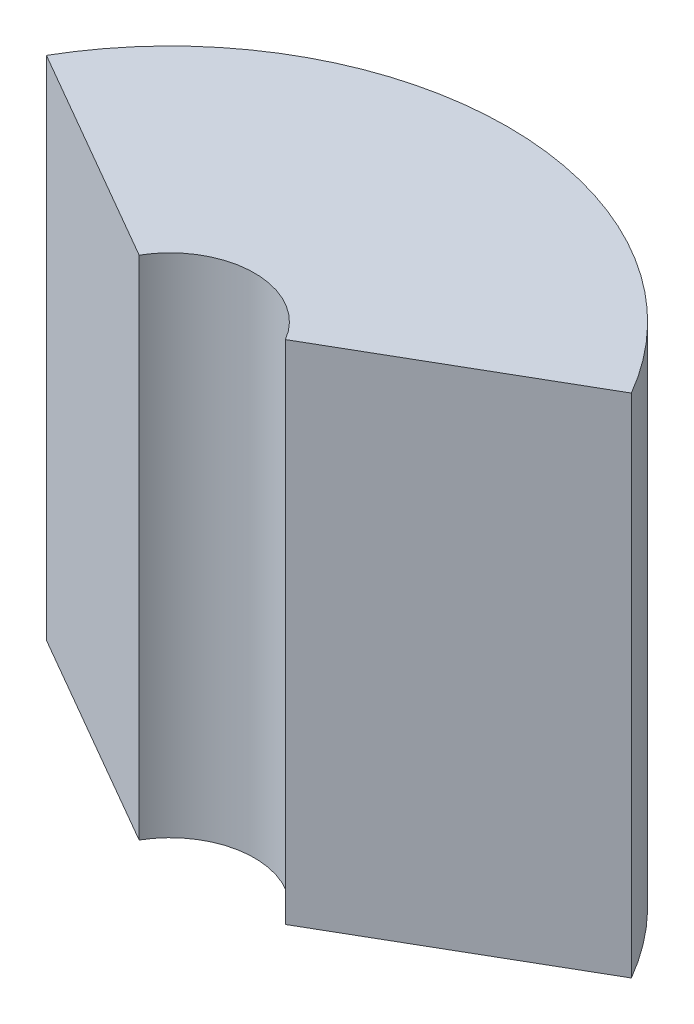
ISO-10303-21;
HEADER;
FILE_DESCRIPTION(('STEP AP214'),'2;1');
FILE_NAME('part.step','',(''),(''),'','','');
FILE_SCHEMA(('AUTOMOTIVE_DESIGN { 1 0 10303 214 1 1 1 1 }'));
ENDSEC;
DATA;
#1=APPLICATION_CONTEXT('core data for automotive mechanical design processes');
#2=APPLICATION_PROTOCOL_DEFINITION('international standard','automotive_design',2000,#1);
#3=PRODUCT_CONTEXT('',#1,'mechanical');
#4=PRODUCT('Part','Part','',(#3));
#5=PRODUCT_RELATED_PRODUCT_CATEGORY('part','',(#4));
#6=PRODUCT_DEFINITION_FORMATION('','',#4);
#7=PRODUCT_DEFINITION_CONTEXT('part definition',#1,'design');
#8=PRODUCT_DEFINITION('design','',#6,#7);
#9=PRODUCT_DEFINITION_SHAPE('','',#8);
#10=(LENGTH_UNIT() NAMED_UNIT(*) SI_UNIT(.MILLI.,.METRE.));
#11=(NAMED_UNIT(*) PLANE_ANGLE_UNIT() SI_UNIT($,.RADIAN.));
#12=(NAMED_UNIT(*) SI_UNIT($,.STERADIAN.) SOLID_ANGLE_UNIT());
#13=UNCERTAINTY_MEASURE_WITH_UNIT(LENGTH_MEASURE(1.E-05),#10,'distance_accuracy_value','');
#14=(GEOMETRIC_REPRESENTATION_CONTEXT(3) GLOBAL_UNCERTAINTY_ASSIGNED_CONTEXT((#13)) GLOBAL_UNIT_ASSIGNED_CONTEXT((#10,
#11,#12)) REPRESENTATION_CONTEXT('',''));
#15=CARTESIAN_POINT('',(0.,0.,0.));
#16=DIRECTION('',(0.,0.,1.));
#17=DIRECTION('',(1.,0.,0.));
#18=AXIS2_PLACEMENT_3D('',#15,#16,#17);
#19=CARTESIAN_POINT('',(0.,0.,0.));
#20=DIRECTION('',(0.,-1.,0.));
#21=DIRECTION('',(0.,0.,-1.));
#22=AXIS2_PLACEMENT_3D('',#19,#20,#21);
#23=CYLINDRICAL_SURFACE('',#22,5.);
#24=CARTESIAN_POINT('',(0.,0.,0.));
#25=DIRECTION('',(0.,-1.,0.));
#26=DIRECTION('',(0.,0.,-1.));
#27=AXIS2_PLACEMENT_3D('',#24,#25,#26);
#28=CIRCLE('',#27,5.);
#29=CARTESIAN_POINT('',(-4.33012701892219,0.,-2.5));
#30=VERTEX_POINT('',#29);
#31=CARTESIAN_POINT('',(4.33012701892219,0.,-2.5));
#32=VERTEX_POINT('',#31);
#33=EDGE_CURVE('E11',#30,#32,#28,.T.);
#34=ORIENTED_EDGE('',*,*,#33,.T.);
#35=DIRECTION('',(0.,-1.,0.));
#36=VECTOR('',#35,1.);
#37=CARTESIAN_POINT('',(4.33012701892219,30.,-2.5));
#38=LINE('',#37,#36);
#39=CARTESIAN_POINT('',(4.33012701892219,30.,-2.5));
#40=VERTEX_POINT('',#39);
#41=EDGE_CURVE('E81',#40,#32,#38,.T.);
#42=ORIENTED_EDGE('',*,*,#41,.F.);
#43=CARTESIAN_POINT('',(0.,30.,0.));
#44=DIRECTION('',(0.,-1.,0.));
#45=DIRECTION('',(0.,0.,-1.));
#46=AXIS2_PLACEMENT_3D('',#43,#44,#45);
#47=CIRCLE('',#46,5.);
#48=CARTESIAN_POINT('',(-4.33012701892219,30.,-2.5));
#49=VERTEX_POINT('',#48);
#50=EDGE_CURVE('E56',#49,#40,#47,.T.);
#51=ORIENTED_EDGE('',*,*,#50,.F.);
#52=DIRECTION('',(0.,-1.,0.));
#53=VECTOR('',#52,1.);
#54=CARTESIAN_POINT('',(-4.33012701892219,30.,-2.5));
#55=LINE('',#54,#53);
#56=EDGE_CURVE('E83',#49,#30,#55,.T.);
#57=ORIENTED_EDGE('',*,*,#56,.T.);
#58=EDGE_LOOP('',(#34,#42,#51,#57));
#59=FACE_BOUND('',#58,.T.);
#60=ADVANCED_FACE('F41',(#59),#23,.F.);
#61=CARTESIAN_POINT('',(-4.33012701892219,0.,-2.5));
#62=DIRECTION('',(0.,-1.,0.));
#63=DIRECTION('',(0.,0.,-1.));
#64=AXIS2_PLACEMENT_3D('',#61,#62,#63);
#65=PLANE('',#64);
#66=CARTESIAN_POINT('',(0.,0.,0.));
#67=DIRECTION('',(0.,-1.,0.));
#68=DIRECTION('',(0.,0.,-1.));
#69=AXIS2_PLACEMENT_3D('',#66,#67,#68);
#70=CIRCLE('',#69,20.);
#71=CARTESIAN_POINT('',(-17.3205080756888,0.,-10.));
#72=VERTEX_POINT('',#71);
#73=CARTESIAN_POINT('',(17.3205080756888,0.,-10.));
#74=VERTEX_POINT('',#73);
#75=EDGE_CURVE('E49',#72,#74,#70,.T.);
#76=ORIENTED_EDGE('',*,*,#75,.T.);
#77=DIRECTION('',(0.866025403784439,0.,-0.5));
#78=VECTOR('',#77,1.);
#79=CARTESIAN_POINT('',(4.33012701892219,0.,-2.5));
#80=LINE('',#79,#78);
#81=EDGE_CURVE('E92',#32,#74,#80,.T.);
#82=ORIENTED_EDGE('',*,*,#81,.F.);
#83=ORIENTED_EDGE('',*,*,#33,.F.);
#84=DIRECTION('',(-0.866025403784439,0.,-0.5));
#85=VECTOR('',#84,1.);
#86=CARTESIAN_POINT('',(-4.33012701892219,0.,-2.5));
#87=LINE('',#86,#85);
#88=EDGE_CURVE('E102',#30,#72,#87,.T.);
#89=ORIENTED_EDGE('',*,*,#88,.T.);
#90=EDGE_LOOP('',(#76,#82,#83,#89));
#91=FACE_BOUND('',#90,.T.);
#92=ADVANCED_FACE('F43',(#91),#65,.T.);
#93=CARTESIAN_POINT('',(0.,0.,0.));
#94=DIRECTION('',(0.,-1.,0.));
#95=DIRECTION('',(0.,0.,-1.));
#96=AXIS2_PLACEMENT_3D('',#93,#94,#95);
#97=CYLINDRICAL_SURFACE('',#96,20.);
#98=CARTESIAN_POINT('',(0.,30.,0.));
#99=DIRECTION('',(0.,-1.,0.));
#100=DIRECTION('',(0.,0.,-1.));
#101=AXIS2_PLACEMENT_3D('',#98,#99,#100);
#102=CIRCLE('',#101,20.);
#103=CARTESIAN_POINT('',(-17.3205080756888,30.,-10.));
#104=VERTEX_POINT('',#103);
#105=CARTESIAN_POINT('',(17.3205080756888,30.,-10.));
#106=VERTEX_POINT('',#105);
#107=EDGE_CURVE('E64',#104,#106,#102,.T.);
#108=ORIENTED_EDGE('',*,*,#107,.T.);
#109=DIRECTION('',(0.,1.,0.));
#110=VECTOR('',#109,1.);
#111=CARTESIAN_POINT('',(17.3205080756888,0.,-10.));
#112=LINE('',#111,#110);
#113=EDGE_CURVE('E96',#74,#106,#112,.T.);
#114=ORIENTED_EDGE('',*,*,#113,.F.);
#115=ORIENTED_EDGE('',*,*,#75,.F.);
#116=DIRECTION('',(0.,1.,0.));
#117=VECTOR('',#116,1.);
#118=CARTESIAN_POINT('',(-17.3205080756888,0.,-10.));
#119=LINE('',#118,#117);
#120=EDGE_CURVE('E104',#72,#104,#119,.T.);
#121=ORIENTED_EDGE('',*,*,#120,.T.);
#122=EDGE_LOOP('',(#108,#114,#115,#121));
#123=FACE_BOUND('',#122,.T.);
#124=ADVANCED_FACE('F110',(#123),#97,.T.);
#125=CARTESIAN_POINT('',(-17.3205080756888,30.,-10.));
#126=DIRECTION('',(0.,1.,0.));
#127=DIRECTION('',(0.,0.,1.));
#128=AXIS2_PLACEMENT_3D('',#125,#126,#127);
#129=PLANE('',#128);
#130=DIRECTION('',(0.866025403784439,0.,0.5));
#131=VECTOR('',#130,1.);
#132=CARTESIAN_POINT('',(-17.3205080756888,30.,-10.));
#133=LINE('',#132,#131);
#134=EDGE_CURVE('E106',#104,#49,#133,.T.);
#135=ORIENTED_EDGE('',*,*,#134,.T.);
#136=ORIENTED_EDGE('',*,*,#50,.T.);
#137=DIRECTION('',(-0.866025403784439,0.,0.5));
#138=VECTOR('',#137,1.);
#139=CARTESIAN_POINT('',(17.3205080756888,30.,-10.));
#140=LINE('',#139,#138);
#141=EDGE_CURVE('E94',#106,#40,#140,.T.);
#142=ORIENTED_EDGE('',*,*,#141,.F.);
#143=ORIENTED_EDGE('',*,*,#107,.F.);
#144=EDGE_LOOP('',(#135,#136,#142,#143));
#145=FACE_BOUND('',#144,.T.);
#146=ADVANCED_FACE('F113',(#145),#129,.T.);
#147=CARTESIAN_POINT('',(0.,0.,0.));
#148=DIRECTION('',(0.5,0.,-0.866025403784439));
#149=DIRECTION('',(-0.866025403784439,0.,-0.5));
#150=AXIS2_PLACEMENT_3D('',#147,#148,#149);
#151=PLANE('',#150);
#152=ORIENTED_EDGE('',*,*,#56,.F.);
#153=ORIENTED_EDGE('',*,*,#134,.F.);
#154=ORIENTED_EDGE('',*,*,#120,.F.);
#155=ORIENTED_EDGE('',*,*,#88,.F.);
#156=EDGE_LOOP('',(#152,#153,#154,#155));
#157=FACE_BOUND('',#156,.T.);
#158=ADVANCED_FACE('F115',(#157),#151,.F.);
#159=CARTESIAN_POINT('',(0.,0.,0.));
#160=DIRECTION('',(0.5,0.,0.866025403784439));
#161=DIRECTION('',(0.866025403784439,0.,-0.5));
#162=AXIS2_PLACEMENT_3D('',#159,#160,#161);
#163=PLANE('',#162);
#164=ORIENTED_EDGE('',*,*,#41,.T.);
#165=ORIENTED_EDGE('',*,*,#81,.T.);
#166=ORIENTED_EDGE('',*,*,#113,.T.);
#167=ORIENTED_EDGE('',*,*,#141,.T.);
#168=EDGE_LOOP('',(#164,#165,#166,#167));
#169=FACE_BOUND('',#168,.T.);
#170=ADVANCED_FACE('F90',(#169),#163,.T.);
#171=CLOSED_SHELL('',(#60,#92,#124,#146,#158,#170));
#172=MANIFOLD_SOLID_BREP('B2',#171);
#173=ADVANCED_BREP_SHAPE_REPRESENTATION('',(#18,#172),#14);
#174=SHAPE_DEFINITION_REPRESENTATION(#9,#173);
ENDSEC;
END-ISO-10303-21;
